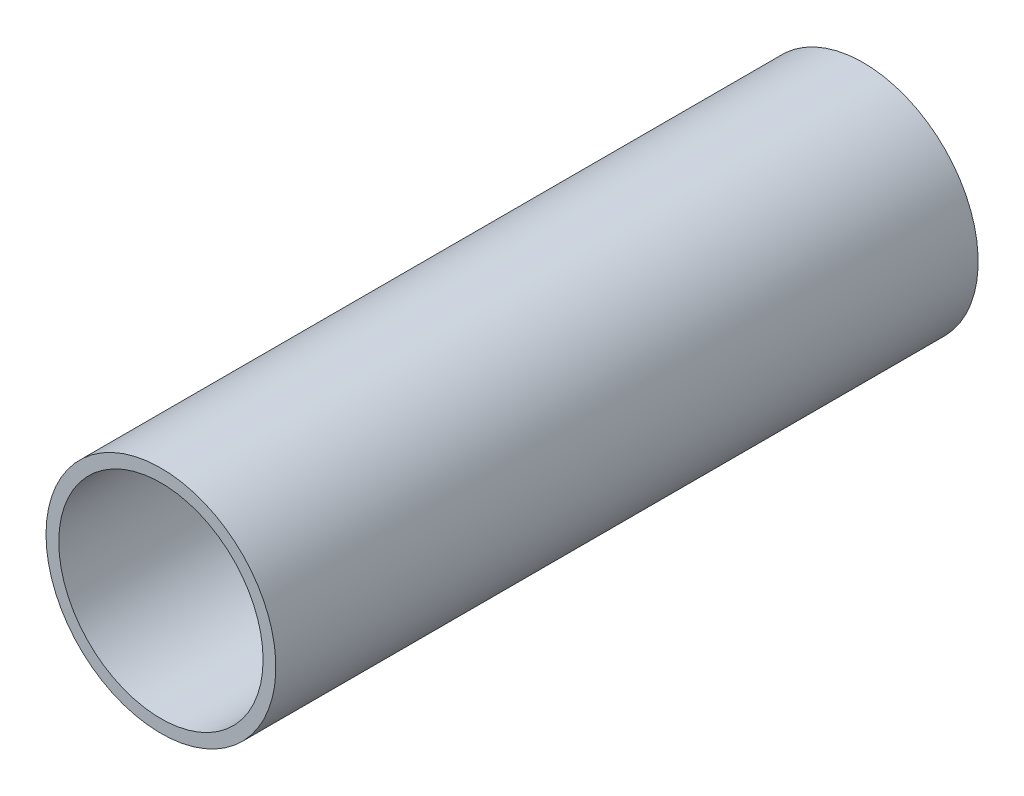
ISO-10303-21;
HEADER;
FILE_DESCRIPTION(('STEP AP214'),'2;1');
FILE_NAME('part.step','',(''),(''),'','','');
FILE_SCHEMA(('AUTOMOTIVE_DESIGN { 1 0 10303 214 1 1 1 1 }'));
ENDSEC;
DATA;
#1=APPLICATION_CONTEXT('core data for automotive mechanical design processes');
#2=APPLICATION_PROTOCOL_DEFINITION('international standard','automotive_design',2000,#1);
#3=PRODUCT_CONTEXT('',#1,'mechanical');
#4=PRODUCT('Part','Part','',(#3));
#5=PRODUCT_RELATED_PRODUCT_CATEGORY('part','',(#4));
#6=PRODUCT_DEFINITION_FORMATION('','',#4);
#7=PRODUCT_DEFINITION_CONTEXT('part definition',#1,'design');
#8=PRODUCT_DEFINITION('design','',#6,#7);
#9=PRODUCT_DEFINITION_SHAPE('','',#8);
#10=(LENGTH_UNIT() NAMED_UNIT(*) SI_UNIT(.MILLI.,.METRE.));
#11=(NAMED_UNIT(*) PLANE_ANGLE_UNIT() SI_UNIT($,.RADIAN.));
#12=(NAMED_UNIT(*) SI_UNIT($,.STERADIAN.) SOLID_ANGLE_UNIT());
#13=UNCERTAINTY_MEASURE_WITH_UNIT(LENGTH_MEASURE(1.E-05),#10,'distance_accuracy_value','');
#14=(GEOMETRIC_REPRESENTATION_CONTEXT(3) GLOBAL_UNCERTAINTY_ASSIGNED_CONTEXT((#13)) GLOBAL_UNIT_ASSIGNED_CONTEXT((#10,
#11,#12)) REPRESENTATION_CONTEXT('',''));
#15=CARTESIAN_POINT('',(0.,0.,0.));
#16=DIRECTION('',(0.,0.,1.));
#17=DIRECTION('',(1.,0.,0.));
#18=AXIS2_PLACEMENT_3D('',#15,#16,#17);
#19=CARTESIAN_POINT('',(0.,0.,110.));
#20=DIRECTION('',(0.,0.,0.999999999999982));
#21=DIRECTION('',(0.999999999999999,0.,0.));
#22=AXIS2_PLACEMENT_3D('',#19,#20,#21);
#23=PLANE('',#22);
#24=CARTESIAN_POINT('',(0.,0.,110.));
#25=DIRECTION('',(0.,0.,0.999999999999982));
#26=DIRECTION('',(0.999999999999999,0.,0.));
#27=AXIS2_PLACEMENT_3D('',#24,#25,#26);
#28=CIRCLE('',#27,18.);
#29=CARTESIAN_POINT('',(-18.,0.,110.));
#30=VERTEX_POINT('',#29);
#31=EDGE_CURVE('E12',#30,#30,#28,.T.);
#32=ORIENTED_EDGE('',*,*,#31,.T.);
#33=EDGE_LOOP('',(#32));
#34=FACE_BOUND('',#33,.T.);
#35=CARTESIAN_POINT('',(0.,0.,110.));
#36=DIRECTION('',(0.,0.,0.999999999999982));
#37=DIRECTION('',(0.999999999999999,0.,0.));
#38=AXIS2_PLACEMENT_3D('',#35,#36,#37);
#39=CIRCLE('',#38,16.);
#40=CARTESIAN_POINT('',(-16.,0.,110.));
#41=VERTEX_POINT('',#40);
#42=EDGE_CURVE('E53',#41,#41,#39,.T.);
#43=ORIENTED_EDGE('',*,*,#42,.F.);
#44=EDGE_LOOP('',(#43));
#45=FACE_BOUND('',#44,.T.);
#46=ADVANCED_FACE('F42',(#34,#45),#23,.T.);
#47=CARTESIAN_POINT('',(0.,0.,0.));
#48=DIRECTION('',(0.,0.,0.999999999999982));
#49=DIRECTION('',(0.999999999999999,0.,0.));
#50=AXIS2_PLACEMENT_3D('',#47,#48,#49);
#51=PLANE('',#50);
#52=CARTESIAN_POINT('',(0.,0.,0.));
#53=DIRECTION('',(0.,0.,0.999999999999982));
#54=DIRECTION('',(0.999999999999999,0.,0.));
#55=AXIS2_PLACEMENT_3D('',#52,#53,#54);
#56=CIRCLE('',#55,18.);
#57=CARTESIAN_POINT('',(-18.,0.,0.));
#58=VERTEX_POINT('',#57);
#59=EDGE_CURVE('E46',#58,#58,#56,.T.);
#60=ORIENTED_EDGE('',*,*,#59,.F.);
#61=EDGE_LOOP('',(#60));
#62=FACE_BOUND('',#61,.T.);
#63=CARTESIAN_POINT('',(0.,0.,0.));
#64=DIRECTION('',(0.,0.,0.999999999999982));
#65=DIRECTION('',(0.999999999999999,0.,0.));
#66=AXIS2_PLACEMENT_3D('',#63,#64,#65);
#67=CIRCLE('',#66,16.);
#68=CARTESIAN_POINT('',(-16.,0.,0.));
#69=VERTEX_POINT('',#68);
#70=EDGE_CURVE('E55',#69,#69,#67,.T.);
#71=ORIENTED_EDGE('',*,*,#70,.T.);
#72=EDGE_LOOP('',(#71));
#73=FACE_BOUND('',#72,.T.);
#74=ADVANCED_FACE('F65',(#62,#73),#51,.F.);
#75=CARTESIAN_POINT('',(0.,0.,110.));
#76=DIRECTION('',(0.,0.,-0.999999999999982));
#77=DIRECTION('',(-0.999999999999999,0.,0.));
#78=AXIS2_PLACEMENT_3D('',#75,#76,#77);
#79=CYLINDRICAL_SURFACE('',#78,18.);
#80=CARTESIAN_POINT('',(-18.,0.,110.));
#81=CARTESIAN_POINT('',(-18.,0.,108.854166666667));
#82=CARTESIAN_POINT('',(-18.,0.,107.708333333333));
#83=CARTESIAN_POINT('',(-18.,0.,105.416666666667));
#84=CARTESIAN_POINT('',(-18.,0.,104.270833333333));
#85=CARTESIAN_POINT('',(-18.,0.,101.979166666667));
#86=CARTESIAN_POINT('',(-18.,0.,100.833333333333));
#87=CARTESIAN_POINT('',(-18.,0.,98.5416666666667));
#88=CARTESIAN_POINT('',(-18.,0.,97.3958333333333));
#89=CARTESIAN_POINT('',(-18.,0.,95.1041666666666));
#90=CARTESIAN_POINT('',(-18.,0.,93.9583333333333));
#91=CARTESIAN_POINT('',(-18.,0.,91.6666666666666));
#92=CARTESIAN_POINT('',(-18.,0.,90.5208333333333));
#93=CARTESIAN_POINT('',(-18.,0.,88.2291666666667));
#94=CARTESIAN_POINT('',(-18.,0.,87.0833333333333));
#95=CARTESIAN_POINT('',(-18.,0.,84.7916666666666));
#96=CARTESIAN_POINT('',(-18.,0.,83.6458333333333));
#97=CARTESIAN_POINT('',(-18.,0.,81.3541666666666));
#98=CARTESIAN_POINT('',(-18.,0.,80.2083333333333));
#99=CARTESIAN_POINT('',(-18.,0.,77.9166666666666));
#100=CARTESIAN_POINT('',(-18.,0.,76.7708333333333));
#101=CARTESIAN_POINT('',(-18.,0.,74.4791666666667));
#102=CARTESIAN_POINT('',(-18.,0.,73.3333333333333));
#103=CARTESIAN_POINT('',(-18.,0.,71.0416666666667));
#104=CARTESIAN_POINT('',(-18.,0.,69.8958333333333));
#105=CARTESIAN_POINT('',(-18.,0.,67.6041666666666));
#106=CARTESIAN_POINT('',(-18.,0.,66.4583333333333));
#107=CARTESIAN_POINT('',(-18.,0.,64.1666666666666));
#108=CARTESIAN_POINT('',(-18.,0.,63.0208333333333));
#109=CARTESIAN_POINT('',(-18.,0.,60.7291666666667));
#110=CARTESIAN_POINT('',(-18.,0.,59.5833333333333));
#111=CARTESIAN_POINT('',(-18.,0.,57.2916666666666));
#112=CARTESIAN_POINT('',(-18.,0.,56.1458333333333));
#113=CARTESIAN_POINT('',(-18.,0.,53.8541666666667));
#114=CARTESIAN_POINT('',(-18.,0.,52.7083333333333));
#115=CARTESIAN_POINT('',(-18.,0.,50.4166666666667));
#116=CARTESIAN_POINT('',(-18.,0.,49.2708333333333));
#117=CARTESIAN_POINT('',(-18.,0.,46.9791666666667));
#118=CARTESIAN_POINT('',(-18.,0.,45.8333333333333));
#119=CARTESIAN_POINT('',(-18.,0.,43.5416666666667));
#120=CARTESIAN_POINT('',(-18.,0.,42.3958333333333));
#121=CARTESIAN_POINT('',(-18.,0.,40.1041666666667));
#122=CARTESIAN_POINT('',(-18.,0.,38.9583333333333));
#123=CARTESIAN_POINT('',(-18.,0.,36.6666666666667));
#124=CARTESIAN_POINT('',(-18.,0.,35.5208333333333));
#125=CARTESIAN_POINT('',(-18.,0.,33.2291666666667));
#126=CARTESIAN_POINT('',(-18.,0.,32.0833333333333));
#127=CARTESIAN_POINT('',(-18.,0.,29.7916666666667));
#128=CARTESIAN_POINT('',(-18.,0.,28.6458333333333));
#129=CARTESIAN_POINT('',(-18.,0.,26.3541666666667));
#130=CARTESIAN_POINT('',(-18.,0.,25.2083333333333));
#131=CARTESIAN_POINT('',(-18.,0.,22.9166666666667));
#132=CARTESIAN_POINT('',(-18.,0.,21.7708333333333));
#133=CARTESIAN_POINT('',(-18.,0.,19.4791666666667));
#134=CARTESIAN_POINT('',(-18.,0.,18.3333333333333));
#135=CARTESIAN_POINT('',(-18.,0.,16.0416666666667));
#136=CARTESIAN_POINT('',(-18.,0.,14.8958333333333));
#137=CARTESIAN_POINT('',(-18.,0.,12.6041666666667));
#138=CARTESIAN_POINT('',(-18.,0.,11.4583333333333));
#139=CARTESIAN_POINT('',(-18.,0.,9.16666666666665));
#140=CARTESIAN_POINT('',(-18.,0.,8.02083333333331));
#141=CARTESIAN_POINT('',(-18.,0.,5.72916666666665));
#142=CARTESIAN_POINT('',(-18.,0.,4.58333333333333));
#143=CARTESIAN_POINT('',(-18.,0.,2.29166666666666));
#144=CARTESIAN_POINT('',(-18.,0.,1.14583333333332));
#145=CARTESIAN_POINT('',(-18.,0.,0.));
#146=B_SPLINE_CURVE_WITH_KNOTS('',3,(#80,#81,#82,#83,#84,#85,#86,#87,#88,#89,#90,#91,#92,#93,
#94,#95,#96,#97,#98,#99,#100,#101,#102,#103,#104,#105,#106,#107,#108,#109,#110,#111,#112,#113,
#114,#115,#116,#117,#118,#119,#120,#121,#122,#123,#124,#125,#126,#127,#128,#129,#130,#131,#132,
#133,#134,#135,#136,#137,#138,#139,#140,#141,#142,#143,#144,#145),.UNSPECIFIED.,.F.,.F.,(4,2,2,
2,2,2,2,2,2,2,2,2,2,2,2,2,2,2,2,2,2,2,2,2,2,2,2,2,2,2,2,2,4),(0.,3.43750000000001,
6.87500000000001,10.3125,13.75,17.1875,20.625,24.0625,27.5,30.9375,34.375,37.8125,41.25,44.6875,
48.125,51.5625,55.,58.4375,61.875,65.3125,68.75,72.1875,75.625,79.0625,82.5,85.9375,89.375,
92.8125,96.25,99.6875,103.125,106.5625,110.),.UNSPECIFIED.);
#147=EDGE_CURVE('BSEAM44',#30,#58,#146,.T.);
#148=ORIENTED_EDGE('',*,*,#31,.F.);
#149=ORIENTED_EDGE('',*,*,#59,.T.);
#150=ORIENTED_EDGE('',*,*,#147,.T.);
#151=ORIENTED_EDGE('',*,*,#147,.F.);
#152=EDGE_LOOP('',(#148,#150,#149,#151));
#153=FACE_BOUND('',#152,.T.);
#154=ADVANCED_FACE('F44',(#153),#79,.T.);
#155=CARTESIAN_POINT('',(0.,0.,110.));
#156=DIRECTION('',(0.,0.,-0.999999999999982));
#157=DIRECTION('',(-0.999999999999999,0.,0.));
#158=AXIS2_PLACEMENT_3D('',#155,#156,#157);
#159=CYLINDRICAL_SURFACE('',#158,16.);
#160=CARTESIAN_POINT('',(-16.,0.,110.));
#161=CARTESIAN_POINT('',(-16.,0.,108.854166666667));
#162=CARTESIAN_POINT('',(-16.,0.,107.708333333333));
#163=CARTESIAN_POINT('',(-16.,0.,105.416666666667));
#164=CARTESIAN_POINT('',(-16.,0.,104.270833333333));
#165=CARTESIAN_POINT('',(-16.,0.,101.979166666667));
#166=CARTESIAN_POINT('',(-16.,0.,100.833333333333));
#167=CARTESIAN_POINT('',(-16.,0.,98.5416666666667));
#168=CARTESIAN_POINT('',(-16.,0.,97.3958333333333));
#169=CARTESIAN_POINT('',(-16.,0.,95.1041666666666));
#170=CARTESIAN_POINT('',(-16.,0.,93.9583333333333));
#171=CARTESIAN_POINT('',(-16.,0.,91.6666666666666));
#172=CARTESIAN_POINT('',(-16.,0.,90.5208333333333));
#173=CARTESIAN_POINT('',(-16.,0.,88.2291666666667));
#174=CARTESIAN_POINT('',(-16.,0.,87.0833333333333));
#175=CARTESIAN_POINT('',(-16.,0.,84.7916666666666));
#176=CARTESIAN_POINT('',(-16.,0.,83.6458333333333));
#177=CARTESIAN_POINT('',(-16.,0.,81.3541666666666));
#178=CARTESIAN_POINT('',(-16.,0.,80.2083333333333));
#179=CARTESIAN_POINT('',(-16.,0.,77.9166666666666));
#180=CARTESIAN_POINT('',(-16.,0.,76.7708333333333));
#181=CARTESIAN_POINT('',(-16.,0.,74.4791666666667));
#182=CARTESIAN_POINT('',(-16.,0.,73.3333333333333));
#183=CARTESIAN_POINT('',(-16.,0.,71.0416666666667));
#184=CARTESIAN_POINT('',(-16.,0.,69.8958333333333));
#185=CARTESIAN_POINT('',(-16.,0.,67.6041666666666));
#186=CARTESIAN_POINT('',(-16.,0.,66.4583333333333));
#187=CARTESIAN_POINT('',(-16.,0.,64.1666666666666));
#188=CARTESIAN_POINT('',(-16.,0.,63.0208333333333));
#189=CARTESIAN_POINT('',(-16.,0.,60.7291666666667));
#190=CARTESIAN_POINT('',(-16.,0.,59.5833333333333));
#191=CARTESIAN_POINT('',(-16.,0.,57.2916666666666));
#192=CARTESIAN_POINT('',(-16.,0.,56.1458333333333));
#193=CARTESIAN_POINT('',(-16.,0.,53.8541666666667));
#194=CARTESIAN_POINT('',(-16.,0.,52.7083333333333));
#195=CARTESIAN_POINT('',(-16.,0.,50.4166666666667));
#196=CARTESIAN_POINT('',(-16.,0.,49.2708333333333));
#197=CARTESIAN_POINT('',(-16.,0.,46.9791666666667));
#198=CARTESIAN_POINT('',(-16.,0.,45.8333333333333));
#199=CARTESIAN_POINT('',(-16.,0.,43.5416666666667));
#200=CARTESIAN_POINT('',(-16.,0.,42.3958333333333));
#201=CARTESIAN_POINT('',(-16.,0.,40.1041666666667));
#202=CARTESIAN_POINT('',(-16.,0.,38.9583333333333));
#203=CARTESIAN_POINT('',(-16.,0.,36.6666666666667));
#204=CARTESIAN_POINT('',(-16.,0.,35.5208333333333));
#205=CARTESIAN_POINT('',(-16.,0.,33.2291666666667));
#206=CARTESIAN_POINT('',(-16.,0.,32.0833333333333));
#207=CARTESIAN_POINT('',(-16.,0.,29.7916666666667));
#208=CARTESIAN_POINT('',(-16.,0.,28.6458333333333));
#209=CARTESIAN_POINT('',(-16.,0.,26.3541666666667));
#210=CARTESIAN_POINT('',(-16.,0.,25.2083333333333));
#211=CARTESIAN_POINT('',(-16.,0.,22.9166666666667));
#212=CARTESIAN_POINT('',(-16.,0.,21.7708333333333));
#213=CARTESIAN_POINT('',(-16.,0.,19.4791666666667));
#214=CARTESIAN_POINT('',(-16.,0.,18.3333333333333));
#215=CARTESIAN_POINT('',(-16.,0.,16.0416666666667));
#216=CARTESIAN_POINT('',(-16.,0.,14.8958333333333));
#217=CARTESIAN_POINT('',(-16.,0.,12.6041666666667));
#218=CARTESIAN_POINT('',(-16.,0.,11.4583333333333));
#219=CARTESIAN_POINT('',(-16.,0.,9.16666666666665));
#220=CARTESIAN_POINT('',(-16.,0.,8.02083333333331));
#221=CARTESIAN_POINT('',(-16.,0.,5.72916666666665));
#222=CARTESIAN_POINT('',(-16.,0.,4.58333333333333));
#223=CARTESIAN_POINT('',(-16.,0.,2.29166666666666));
#224=CARTESIAN_POINT('',(-16.,0.,1.14583333333332));
#225=CARTESIAN_POINT('',(-16.,0.,0.));
#226=B_SPLINE_CURVE_WITH_KNOTS('',3,(#160,#161,#162,#163,#164,#165,#166,#167,#168,#169,#170,
#171,#172,#173,#174,#175,#176,#177,#178,#179,#180,#181,#182,#183,#184,#185,#186,#187,#188,#189,
#190,#191,#192,#193,#194,#195,#196,#197,#198,#199,#200,#201,#202,#203,#204,#205,#206,#207,#208,
#209,#210,#211,#212,#213,#214,#215,#216,#217,#218,#219,#220,#221,#222,#223,#224,#225),
.UNSPECIFIED.,.F.,.F.,(4,2,2,2,2,2,2,2,2,2,2,2,2,2,2,2,2,2,2,2,2,2,2,2,2,2,2,2,2,2,2,2,4),(0.,
3.43750000000001,6.87500000000001,10.3125,13.75,17.1875,20.625,24.0625,27.5,30.9375,34.375,
37.8125,41.25,44.6875,48.125,51.5625,55.,58.4375,61.875,65.3125,68.75,72.1875,75.625,79.0625,
82.5,85.9375,89.375,92.8125,96.25,99.6875,103.125,106.5625,110.),.UNSPECIFIED.);
#227=EDGE_CURVE('BSEAM61',#41,#69,#226,.T.);
#228=ORIENTED_EDGE('',*,*,#42,.T.);
#229=ORIENTED_EDGE('',*,*,#70,.F.);
#230=ORIENTED_EDGE('',*,*,#227,.T.);
#231=ORIENTED_EDGE('',*,*,#227,.F.);
#232=EDGE_LOOP('',(#228,#230,#229,#231));
#233=FACE_BOUND('',#232,.T.);
#234=ADVANCED_FACE('F61',(#233),#159,.F.);
#235=CLOSED_SHELL('',(#46,#74,#154,#234));
#236=MANIFOLD_SOLID_BREP('B2',#235);
#237=ADVANCED_BREP_SHAPE_REPRESENTATION('',(#18,#236),#14);
#238=SHAPE_DEFINITION_REPRESENTATION(#9,#237);
ENDSEC;
END-ISO-10303-21;
